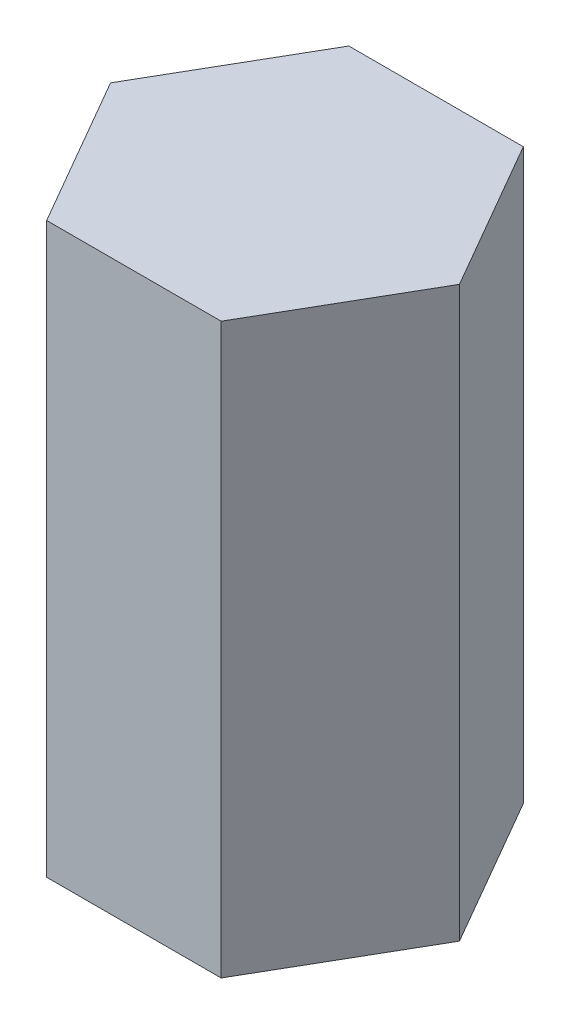
ISO-10303-21;
HEADER;
FILE_DESCRIPTION(('STEP AP214'),'2;1');
FILE_NAME('part.step','',(''),(''),'','','');
FILE_SCHEMA(('AUTOMOTIVE_DESIGN { 1 0 10303 214 1 1 1 1 }'));
ENDSEC;
DATA;
#1=APPLICATION_CONTEXT('core data for automotive mechanical design processes');
#2=APPLICATION_PROTOCOL_DEFINITION('international standard','automotive_design',2000,#1);
#3=PRODUCT_CONTEXT('',#1,'mechanical');
#4=PRODUCT('Part','Part','',(#3));
#5=PRODUCT_RELATED_PRODUCT_CATEGORY('part','',(#4));
#6=PRODUCT_DEFINITION_FORMATION('','',#4);
#7=PRODUCT_DEFINITION_CONTEXT('part definition',#1,'design');
#8=PRODUCT_DEFINITION('design','',#6,#7);
#9=PRODUCT_DEFINITION_SHAPE('','',#8);
#10=(LENGTH_UNIT() NAMED_UNIT(*) SI_UNIT(.MILLI.,.METRE.));
#11=(NAMED_UNIT(*) PLANE_ANGLE_UNIT() SI_UNIT($,.RADIAN.));
#12=(NAMED_UNIT(*) SI_UNIT($,.STERADIAN.) SOLID_ANGLE_UNIT());
#13=UNCERTAINTY_MEASURE_WITH_UNIT(LENGTH_MEASURE(1.E-05),#10,'distance_accuracy_value','');
#14=(GEOMETRIC_REPRESENTATION_CONTEXT(3) GLOBAL_UNCERTAINTY_ASSIGNED_CONTEXT((#13)) GLOBAL_UNIT_ASSIGNED_CONTEXT((#10,
#11,#12)) REPRESENTATION_CONTEXT('',''));
#15=CARTESIAN_POINT('',(0.,0.,0.));
#16=DIRECTION('',(0.,0.,1.));
#17=DIRECTION('',(1.,0.,0.));
#18=AXIS2_PLACEMENT_3D('',#15,#16,#17);
#19=CARTESIAN_POINT('',(-4.90747728811182,32.,8.5));
#20=DIRECTION('',(0.,0.,-1.));
#21=DIRECTION('',(-1.,0.,0.));
#22=AXIS2_PLACEMENT_3D('',#19,#20,#21);
#23=PLANE('',#22);
#24=DIRECTION('',(1.,0.,0.));
#25=VECTOR('',#24,1.);
#26=CARTESIAN_POINT('',(-4.90747728811182,0.,8.5));
#27=LINE('',#26,#25);
#28=CARTESIAN_POINT('',(-4.90747728811182,0.,8.5));
#29=VERTEX_POINT('',#28);
#30=CARTESIAN_POINT('',(4.90747728811182,0.,8.5));
#31=VERTEX_POINT('',#30);
#32=EDGE_CURVE('E134',#29,#31,#27,.T.);
#33=ORIENTED_EDGE('',*,*,#32,.T.);
#34=DIRECTION('',(0.,-1.,0.));
#35=VECTOR('',#34,1.);
#36=CARTESIAN_POINT('',(4.90747728811182,32.,8.5));
#37=LINE('',#36,#35);
#38=CARTESIAN_POINT('',(4.90747728811182,32.,8.5));
#39=VERTEX_POINT('',#38);
#40=EDGE_CURVE('E11',#39,#31,#37,.T.);
#41=ORIENTED_EDGE('',*,*,#40,.F.);
#42=DIRECTION('',(1.,0.,0.));
#43=VECTOR('',#42,1.);
#44=CARTESIAN_POINT('',(-4.90747728811182,32.,8.5));
#45=LINE('',#44,#43);
#46=CARTESIAN_POINT('',(-4.90747728811182,32.,8.5));
#47=VERTEX_POINT('',#46);
#48=EDGE_CURVE('E150',#47,#39,#45,.T.);
#49=ORIENTED_EDGE('',*,*,#48,.F.);
#50=DIRECTION('',(0.,-1.,0.));
#51=VECTOR('',#50,1.);
#52=CARTESIAN_POINT('',(-4.90747728811182,32.,8.5));
#53=LINE('',#52,#51);
#54=EDGE_CURVE('E130',#47,#29,#53,.T.);
#55=ORIENTED_EDGE('',*,*,#54,.T.);
#56=EDGE_LOOP('',(#33,#41,#49,#55));
#57=FACE_BOUND('',#56,.T.);
#58=ADVANCED_FACE('F45',(#57),#23,.F.);
#59=CARTESIAN_POINT('',(4.90747728811182,32.,8.5));
#60=DIRECTION('',(-0.866025403784438,0.,-0.5));
#61=DIRECTION('',(-0.5,0.,0.866025403784438));
#62=AXIS2_PLACEMENT_3D('',#59,#60,#61);
#63=PLANE('',#62);
#64=DIRECTION('',(0.5,0.,-0.866025403784438));
#65=VECTOR('',#64,1.);
#66=CARTESIAN_POINT('',(4.90747728811182,0.,8.5));
#67=LINE('',#66,#65);
#68=CARTESIAN_POINT('',(9.81495457622364,0.,0.));
#69=VERTEX_POINT('',#68);
#70=EDGE_CURVE('E138',#31,#69,#67,.T.);
#71=ORIENTED_EDGE('',*,*,#70,.T.);
#72=DIRECTION('',(0.,-1.,0.));
#73=VECTOR('',#72,1.);
#74=CARTESIAN_POINT('',(9.81495457622364,32.,0.));
#75=LINE('',#74,#73);
#76=CARTESIAN_POINT('',(9.81495457622364,32.,0.));
#77=VERTEX_POINT('',#76);
#78=EDGE_CURVE('E54',#77,#69,#75,.T.);
#79=ORIENTED_EDGE('',*,*,#78,.F.);
#80=DIRECTION('',(0.5,0.,-0.866025403784438));
#81=VECTOR('',#80,1.);
#82=CARTESIAN_POINT('',(4.90747728811182,32.,8.5));
#83=LINE('',#82,#81);
#84=EDGE_CURVE('E99',#39,#77,#83,.T.);
#85=ORIENTED_EDGE('',*,*,#84,.F.);
#86=ORIENTED_EDGE('',*,*,#40,.T.);
#87=EDGE_LOOP('',(#71,#79,#85,#86));
#88=FACE_BOUND('',#87,.T.);
#89=ADVANCED_FACE('F178',(#88),#63,.F.);
#90=CARTESIAN_POINT('',(9.81495457622364,32.,0.));
#91=DIRECTION('',(-0.866025403784439,0.,0.5));
#92=DIRECTION('',(0.5,0.,0.866025403784439));
#93=AXIS2_PLACEMENT_3D('',#90,#91,#92);
#94=PLANE('',#93);
#95=DIRECTION('',(-0.5,0.,-0.866025403784439));
#96=VECTOR('',#95,1.);
#97=CARTESIAN_POINT('',(9.81495457622364,0.,0.));
#98=LINE('',#97,#96);
#99=CARTESIAN_POINT('',(4.90747728811182,0.,-8.5));
#100=VERTEX_POINT('',#99);
#101=EDGE_CURVE('E141',#69,#100,#98,.T.);
#102=ORIENTED_EDGE('',*,*,#101,.T.);
#103=DIRECTION('',(0.,-1.,0.));
#104=VECTOR('',#103,1.);
#105=CARTESIAN_POINT('',(4.90747728811182,32.,-8.5));
#106=LINE('',#105,#104);
#107=CARTESIAN_POINT('',(4.90747728811182,32.,-8.5));
#108=VERTEX_POINT('',#107);
#109=EDGE_CURVE('E123',#108,#100,#106,.T.);
#110=ORIENTED_EDGE('',*,*,#109,.F.);
#111=DIRECTION('',(-0.5,0.,-0.866025403784439));
#112=VECTOR('',#111,1.);
#113=CARTESIAN_POINT('',(9.81495457622364,32.,0.));
#114=LINE('',#113,#112);
#115=EDGE_CURVE('E112',#77,#108,#114,.T.);
#116=ORIENTED_EDGE('',*,*,#115,.F.);
#117=ORIENTED_EDGE('',*,*,#78,.T.);
#118=EDGE_LOOP('',(#102,#110,#116,#117));
#119=FACE_BOUND('',#118,.T.);
#120=ADVANCED_FACE('F160',(#119),#94,.F.);
#121=CARTESIAN_POINT('',(4.90747728811182,32.,-8.5));
#122=DIRECTION('',(0.,0.,1.));
#123=DIRECTION('',(1.,0.,0.));
#124=AXIS2_PLACEMENT_3D('',#121,#122,#123);
#125=PLANE('',#124);
#126=DIRECTION('',(-1.,0.,0.));
#127=VECTOR('',#126,1.);
#128=CARTESIAN_POINT('',(4.90747728811182,0.,-8.5));
#129=LINE('',#128,#127);
#130=CARTESIAN_POINT('',(-4.90747728811182,0.,-8.5));
#131=VERTEX_POINT('',#130);
#132=EDGE_CURVE('E121',#100,#131,#129,.T.);
#133=ORIENTED_EDGE('',*,*,#132,.T.);
#134=DIRECTION('',(0.,-1.,0.));
#135=VECTOR('',#134,1.);
#136=CARTESIAN_POINT('',(-4.90747728811182,32.,-8.5));
#137=LINE('',#136,#135);
#138=CARTESIAN_POINT('',(-4.90747728811182,32.,-8.5));
#139=VERTEX_POINT('',#138);
#140=EDGE_CURVE('E118',#139,#131,#137,.T.);
#141=ORIENTED_EDGE('',*,*,#140,.F.);
#142=DIRECTION('',(-1.,0.,0.));
#143=VECTOR('',#142,1.);
#144=CARTESIAN_POINT('',(4.90747728811182,32.,-8.5));
#145=LINE('',#144,#143);
#146=EDGE_CURVE('E106',#108,#139,#145,.T.);
#147=ORIENTED_EDGE('',*,*,#146,.F.);
#148=ORIENTED_EDGE('',*,*,#109,.T.);
#149=EDGE_LOOP('',(#133,#141,#147,#148));
#150=FACE_BOUND('',#149,.T.);
#151=ADVANCED_FACE('F119',(#150),#125,.F.);
#152=CARTESIAN_POINT('',(-4.90747728811182,32.,-8.5));
#153=DIRECTION('',(0.866025403784438,0.,0.5));
#154=DIRECTION('',(0.5,0.,-0.866025403784438));
#155=AXIS2_PLACEMENT_3D('',#152,#153,#154);
#156=PLANE('',#155);
#157=DIRECTION('',(-0.5,0.,0.866025403784438));
#158=VECTOR('',#157,1.);
#159=CARTESIAN_POINT('',(-4.90747728811182,0.,-8.5));
#160=LINE('',#159,#158);
#161=CARTESIAN_POINT('',(-9.81495457622364,0.,0.));
#162=VERTEX_POINT('',#161);
#163=EDGE_CURVE('E85',#131,#162,#160,.T.);
#164=ORIENTED_EDGE('',*,*,#163,.T.);
#165=DIRECTION('',(0.,-1.,0.));
#166=VECTOR('',#165,1.);
#167=CARTESIAN_POINT('',(-9.81495457622364,32.,0.));
#168=LINE('',#167,#166);
#169=CARTESIAN_POINT('',(-9.81495457622364,32.,0.));
#170=VERTEX_POINT('',#169);
#171=EDGE_CURVE('E124',#170,#162,#168,.T.);
#172=ORIENTED_EDGE('',*,*,#171,.F.);
#173=DIRECTION('',(-0.5,0.,0.866025403784438));
#174=VECTOR('',#173,1.);
#175=CARTESIAN_POINT('',(-4.90747728811182,32.,-8.5));
#176=LINE('',#175,#174);
#177=EDGE_CURVE('E110',#139,#170,#176,.T.);
#178=ORIENTED_EDGE('',*,*,#177,.F.);
#179=ORIENTED_EDGE('',*,*,#140,.T.);
#180=EDGE_LOOP('',(#164,#172,#178,#179));
#181=FACE_BOUND('',#180,.T.);
#182=ADVANCED_FACE('F126',(#181),#156,.F.);
#183=CARTESIAN_POINT('',(-9.81495457622364,32.,0.));
#184=DIRECTION('',(0.866025403784439,0.,-0.5));
#185=DIRECTION('',(-0.5,0.,-0.866025403784439));
#186=AXIS2_PLACEMENT_3D('',#183,#184,#185);
#187=PLANE('',#186);
#188=DIRECTION('',(0.5,0.,0.866025403784439));
#189=VECTOR('',#188,1.);
#190=CARTESIAN_POINT('',(-9.81495457622364,0.,0.));
#191=LINE('',#190,#189);
#192=EDGE_CURVE('E91',#162,#29,#191,.T.);
#193=ORIENTED_EDGE('',*,*,#192,.T.);
#194=ORIENTED_EDGE('',*,*,#54,.F.);
#195=DIRECTION('',(0.5,0.,0.866025403784439));
#196=VECTOR('',#195,1.);
#197=CARTESIAN_POINT('',(-9.81495457622364,32.,0.));
#198=LINE('',#197,#196);
#199=EDGE_CURVE('E62',#170,#47,#198,.T.);
#200=ORIENTED_EDGE('',*,*,#199,.F.);
#201=ORIENTED_EDGE('',*,*,#171,.T.);
#202=EDGE_LOOP('',(#193,#194,#200,#201));
#203=FACE_BOUND('',#202,.T.);
#204=ADVANCED_FACE('F167',(#203),#187,.F.);
#205=CARTESIAN_POINT('',(0.,32.,0.));
#206=DIRECTION('',(0.,1.,0.));
#207=DIRECTION('',(0.,0.,1.));
#208=AXIS2_PLACEMENT_3D('',#205,#206,#207);
#209=PLANE('',#208);
#210=ORIENTED_EDGE('',*,*,#48,.T.);
#211=ORIENTED_EDGE('',*,*,#84,.T.);
#212=ORIENTED_EDGE('',*,*,#115,.T.);
#213=ORIENTED_EDGE('',*,*,#146,.T.);
#214=ORIENTED_EDGE('',*,*,#177,.T.);
#215=ORIENTED_EDGE('',*,*,#199,.T.);
#216=EDGE_LOOP('',(#210,#211,#212,#213,#214,#215));
#217=FACE_BOUND('',#216,.T.);
#218=ADVANCED_FACE('F108',(#217),#209,.T.);
#219=CARTESIAN_POINT('',(0.,0.,0.));
#220=DIRECTION('',(0.,1.,0.));
#221=DIRECTION('',(0.,0.,1.));
#222=AXIS2_PLACEMENT_3D('',#219,#220,#221);
#223=PLANE('',#222);
#224=ORIENTED_EDGE('',*,*,#32,.F.);
#225=ORIENTED_EDGE('',*,*,#192,.F.);
#226=ORIENTED_EDGE('',*,*,#163,.F.);
#227=ORIENTED_EDGE('',*,*,#132,.F.);
#228=ORIENTED_EDGE('',*,*,#101,.F.);
#229=ORIENTED_EDGE('',*,*,#70,.F.);
#230=EDGE_LOOP('',(#224,#225,#226,#227,#228,#229));
#231=FACE_BOUND('',#230,.T.);
#232=ADVANCED_FACE('F163',(#231),#223,.F.);
#233=CLOSED_SHELL('',(#58,#89,#120,#151,#182,#204,#218,#232));
#234=MANIFOLD_SOLID_BREP('B2',#233);
#235=ADVANCED_BREP_SHAPE_REPRESENTATION('',(#18,#234),#14);
#236=SHAPE_DEFINITION_REPRESENTATION(#9,#235);
ENDSEC;
END-ISO-10303-21;
